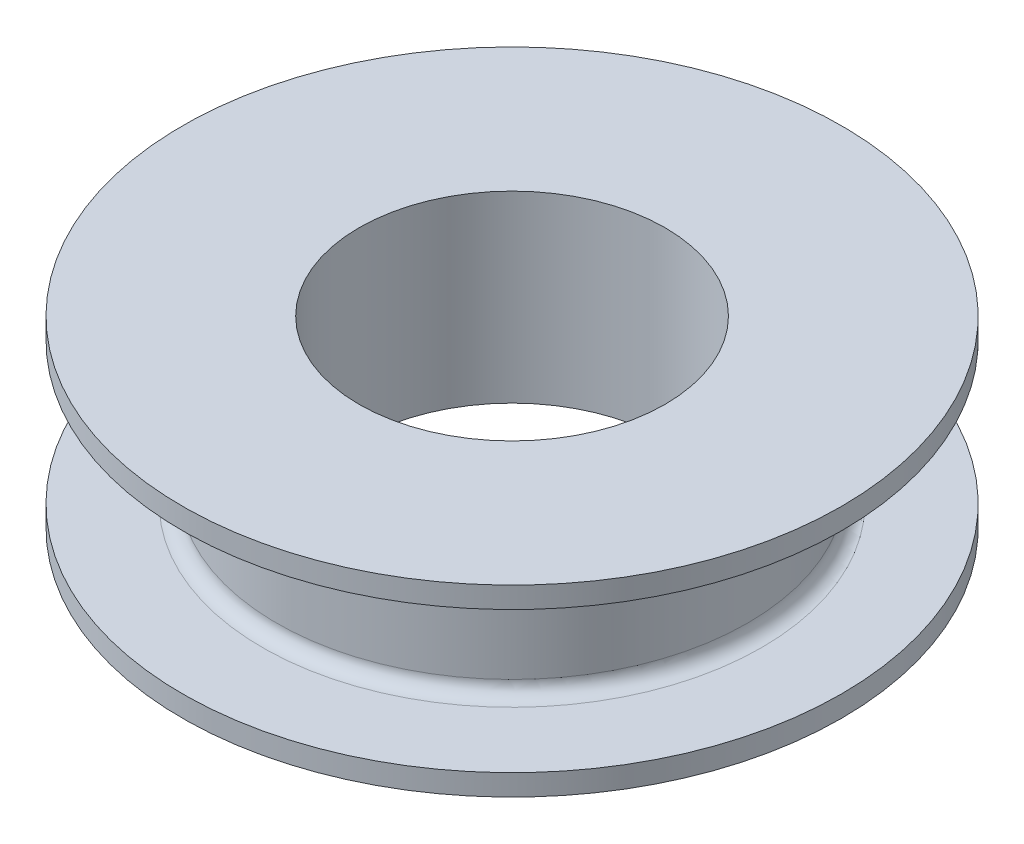
ISO-10303-21;
HEADER;
FILE_DESCRIPTION(('STEP AP214'),'2;1');
FILE_NAME('part.step','',(''),(''),'','','');
FILE_SCHEMA(('AUTOMOTIVE_DESIGN { 1 0 10303 214 1 1 1 1 }'));
ENDSEC;
DATA;
#1=APPLICATION_CONTEXT('core data for automotive mechanical design processes');
#2=APPLICATION_PROTOCOL_DEFINITION('international standard','automotive_design',2000,#1);
#3=PRODUCT_CONTEXT('',#1,'mechanical');
#4=PRODUCT('Part','Part','',(#3));
#5=PRODUCT_RELATED_PRODUCT_CATEGORY('part','',(#4));
#6=PRODUCT_DEFINITION_FORMATION('','',#4);
#7=PRODUCT_DEFINITION_CONTEXT('part definition',#1,'design');
#8=PRODUCT_DEFINITION('design','',#6,#7);
#9=PRODUCT_DEFINITION_SHAPE('','',#8);
#10=(LENGTH_UNIT() NAMED_UNIT(*) SI_UNIT(.MILLI.,.METRE.));
#11=(NAMED_UNIT(*) PLANE_ANGLE_UNIT() SI_UNIT($,.RADIAN.));
#12=(NAMED_UNIT(*) SI_UNIT($,.STERADIAN.) SOLID_ANGLE_UNIT());
#13=UNCERTAINTY_MEASURE_WITH_UNIT(LENGTH_MEASURE(1.E-05),#10,'distance_accuracy_value','');
#14=(GEOMETRIC_REPRESENTATION_CONTEXT(3) GLOBAL_UNCERTAINTY_ASSIGNED_CONTEXT((#13)) GLOBAL_UNIT_ASSIGNED_CONTEXT((#10,
#11,#12)) REPRESENTATION_CONTEXT('',''));
#15=CARTESIAN_POINT('',(0.,0.,0.));
#16=DIRECTION('',(0.,0.,1.));
#17=DIRECTION('',(1.,0.,0.));
#18=AXIS2_PLACEMENT_3D('',#15,#16,#17);
#19=CARTESIAN_POINT('',(0.,1.95,0.));
#20=DIRECTION('',(0.,-1.,0.));
#21=DIRECTION('',(1.,0.,0.));
#22=AXIS2_PLACEMENT_3D('',#19,#20,#21);
#23=CYLINDRICAL_SURFACE('',#22,7.);
#24=CARTESIAN_POINT('',(0.,3.9,0.));
#25=DIRECTION('',(0.,-1.,0.));
#26=DIRECTION('',(1.,0.,0.));
#27=AXIS2_PLACEMENT_3D('',#24,#25,#26);
#28=CIRCLE('',#27,7.);
#29=CARTESIAN_POINT('',(7.,3.9,0.));
#30=VERTEX_POINT('',#29);
#31=EDGE_CURVE('E67',#30,#30,#28,.T.);
#32=ORIENTED_EDGE('',*,*,#31,.T.);
#33=EDGE_LOOP('',(#32));
#34=FACE_BOUND('',#33,.T.);
#35=CARTESIAN_POINT('',(0.,3.45,0.));
#36=DIRECTION('',(0.,-1.,0.));
#37=DIRECTION('',(1.,0.,0.));
#38=AXIS2_PLACEMENT_3D('',#35,#36,#37);
#39=CIRCLE('',#38,7.);
#40=CARTESIAN_POINT('',(7.,3.45,0.));
#41=VERTEX_POINT('',#40);
#42=EDGE_CURVE('E10',#41,#41,#39,.T.);
#43=ORIENTED_EDGE('',*,*,#42,.F.);
#44=EDGE_LOOP('',(#43));
#45=FACE_BOUND('',#44,.T.);
#46=ADVANCED_FACE('F33',(#34,#45),#23,.T.);
#47=CARTESIAN_POINT('',(7.,3.45,0.));
#48=DIRECTION('',(0.,-1.,0.));
#49=DIRECTION('',(1.,0.,0.));
#50=AXIS2_PLACEMENT_3D('',#47,#48,#49);
#51=PLANE('',#50);
#52=ORIENTED_EDGE('',*,*,#42,.T.);
#53=EDGE_LOOP('',(#52));
#54=FACE_BOUND('',#53,.T.);
#55=CARTESIAN_POINT('',(0.,3.45,0.));
#56=DIRECTION('',(0.,-1.,0.));
#57=DIRECTION('',(1.,0.,0.));
#58=AXIS2_PLACEMENT_3D('',#55,#56,#57);
#59=CIRCLE('',#58,5.3);
#60=CARTESIAN_POINT('',(5.3,3.45,0.));
#61=VERTEX_POINT('',#60);
#62=EDGE_CURVE('E39',#61,#61,#59,.T.);
#63=ORIENTED_EDGE('',*,*,#62,.F.);
#64=EDGE_LOOP('',(#63));
#65=FACE_BOUND('',#64,.T.);
#66=ADVANCED_FACE('F85',(#54,#65),#51,.T.);
#67=CARTESIAN_POINT('',(0.,3.15,0.));
#68=DIRECTION('',(0.,-1.,0.));
#69=DIRECTION('',(1.,0.,0.));
#70=AXIS2_PLACEMENT_3D('',#67,#68,#69);
#71=TOROIDAL_SURFACE('',#70,5.3,0.3);
#72=ORIENTED_EDGE('',*,*,#62,.T.);
#73=EDGE_LOOP('',(#72));
#74=FACE_BOUND('',#73,.T.);
#75=CARTESIAN_POINT('',(0.,3.15,0.));
#76=DIRECTION('',(0.,-1.,0.));
#77=DIRECTION('',(1.,0.,0.));
#78=AXIS2_PLACEMENT_3D('',#75,#76,#77);
#79=CIRCLE('',#78,5.);
#80=CARTESIAN_POINT('',(5.,3.15,0.));
#81=VERTEX_POINT('',#80);
#82=EDGE_CURVE('E43',#81,#81,#79,.T.);
#83=ORIENTED_EDGE('',*,*,#82,.F.);
#84=EDGE_LOOP('',(#83));
#85=FACE_BOUND('',#84,.T.);
#86=ADVANCED_FACE('F89',(#74,#85),#71,.F.);
#87=CARTESIAN_POINT('',(0.,1.95,0.));
#88=DIRECTION('',(0.,-1.,0.));
#89=DIRECTION('',(1.,0.,0.));
#90=AXIS2_PLACEMENT_3D('',#87,#88,#89);
#91=CYLINDRICAL_SURFACE('',#90,5.);
#92=ORIENTED_EDGE('',*,*,#82,.T.);
#93=EDGE_LOOP('',(#92));
#94=FACE_BOUND('',#93,.T.);
#95=CARTESIAN_POINT('',(0.,0.749999999999999,0.));
#96=DIRECTION('',(0.,-1.,0.));
#97=DIRECTION('',(1.,0.,0.));
#98=AXIS2_PLACEMENT_3D('',#95,#96,#97);
#99=CIRCLE('',#98,5.);
#100=CARTESIAN_POINT('',(5.,0.75,0.));
#101=VERTEX_POINT('',#100);
#102=EDGE_CURVE('E47',#101,#101,#99,.T.);
#103=ORIENTED_EDGE('',*,*,#102,.F.);
#104=EDGE_LOOP('',(#103));
#105=FACE_BOUND('',#104,.T.);
#106=ADVANCED_FACE('F93',(#94,#105),#91,.T.);
#107=CARTESIAN_POINT('',(0.,0.749999999999999,0.));
#108=DIRECTION('',(0.,-1.,0.));
#109=DIRECTION('',(1.,0.,0.));
#110=AXIS2_PLACEMENT_3D('',#107,#108,#109);
#111=TOROIDAL_SURFACE('',#110,5.3,0.3);
#112=ORIENTED_EDGE('',*,*,#102,.T.);
#113=EDGE_LOOP('',(#112));
#114=FACE_BOUND('',#113,.T.);
#115=CARTESIAN_POINT('',(0.,0.449999999999999,0.));
#116=DIRECTION('',(0.,-1.,0.));
#117=DIRECTION('',(1.,0.,0.));
#118=AXIS2_PLACEMENT_3D('',#115,#116,#117);
#119=CIRCLE('',#118,5.3);
#120=CARTESIAN_POINT('',(5.3,0.45,0.));
#121=VERTEX_POINT('',#120);
#122=EDGE_CURVE('E52',#121,#121,#119,.T.);
#123=ORIENTED_EDGE('',*,*,#122,.F.);
#124=EDGE_LOOP('',(#123));
#125=FACE_BOUND('',#124,.T.);
#126=ADVANCED_FACE('F99',(#114,#125),#111,.F.);
#127=CARTESIAN_POINT('',(7.,0.450000000000001,0.));
#128=DIRECTION('',(0.,1.,0.));
#129=DIRECTION('',(-1.,0.,0.));
#130=AXIS2_PLACEMENT_3D('',#127,#128,#129);
#131=PLANE('',#130);
#132=ORIENTED_EDGE('',*,*,#122,.T.);
#133=EDGE_LOOP('',(#132));
#134=FACE_BOUND('',#133,.T.);
#135=CARTESIAN_POINT('',(0.,0.449999999999999,0.));
#136=DIRECTION('',(0.,-1.,0.));
#137=DIRECTION('',(1.,0.,0.));
#138=AXIS2_PLACEMENT_3D('',#135,#136,#137);
#139=CIRCLE('',#138,7.);
#140=CARTESIAN_POINT('',(7.,0.450000000000001,0.));
#141=VERTEX_POINT('',#140);
#142=EDGE_CURVE('E55',#141,#141,#139,.T.);
#143=ORIENTED_EDGE('',*,*,#142,.F.);
#144=EDGE_LOOP('',(#143));
#145=FACE_BOUND('',#144,.T.);
#146=ADVANCED_FACE('F103',(#134,#145),#131,.T.);
#147=CARTESIAN_POINT('',(0.,1.95,0.));
#148=DIRECTION('',(0.,-1.,0.));
#149=DIRECTION('',(1.,0.,0.));
#150=AXIS2_PLACEMENT_3D('',#147,#148,#149);
#151=CYLINDRICAL_SURFACE('',#150,7.);
#152=ORIENTED_EDGE('',*,*,#142,.T.);
#153=EDGE_LOOP('',(#152));
#154=FACE_BOUND('',#153,.T.);
#155=CARTESIAN_POINT('',(0.,0.,0.));
#156=DIRECTION('',(0.,-1.,0.));
#157=DIRECTION('',(1.,0.,0.));
#158=AXIS2_PLACEMENT_3D('',#155,#156,#157);
#159=CIRCLE('',#158,7.);
#160=CARTESIAN_POINT('',(7.,0.,0.));
#161=VERTEX_POINT('',#160);
#162=EDGE_CURVE('E58',#161,#161,#159,.T.);
#163=ORIENTED_EDGE('',*,*,#162,.F.);
#164=EDGE_LOOP('',(#163));
#165=FACE_BOUND('',#164,.T.);
#166=ADVANCED_FACE('F107',(#154,#165),#151,.T.);
#167=CARTESIAN_POINT('',(3.25,0.,0.));
#168=DIRECTION('',(0.,-1.,0.));
#169=DIRECTION('',(1.,0.,0.));
#170=AXIS2_PLACEMENT_3D('',#167,#168,#169);
#171=PLANE('',#170);
#172=ORIENTED_EDGE('',*,*,#162,.T.);
#173=EDGE_LOOP('',(#172));
#174=FACE_BOUND('',#173,.T.);
#175=CARTESIAN_POINT('',(0.,0.,0.));
#176=DIRECTION('',(0.,-1.,0.));
#177=DIRECTION('',(1.,0.,0.));
#178=AXIS2_PLACEMENT_3D('',#175,#176,#177);
#179=CIRCLE('',#178,3.25);
#180=CARTESIAN_POINT('',(3.25,0.,0.));
#181=VERTEX_POINT('',#180);
#182=EDGE_CURVE('E61',#181,#181,#179,.T.);
#183=ORIENTED_EDGE('',*,*,#182,.F.);
#184=EDGE_LOOP('',(#183));
#185=FACE_BOUND('',#184,.T.);
#186=ADVANCED_FACE('F81',(#174,#185),#171,.T.);
#187=CARTESIAN_POINT('',(0.,1.95,0.));
#188=DIRECTION('',(0.,-1.,0.));
#189=DIRECTION('',(1.,0.,0.));
#190=AXIS2_PLACEMENT_3D('',#187,#188,#189);
#191=CYLINDRICAL_SURFACE('',#190,3.25);
#192=ORIENTED_EDGE('',*,*,#182,.T.);
#193=EDGE_LOOP('',(#192));
#194=FACE_BOUND('',#193,.T.);
#195=CARTESIAN_POINT('',(0.,3.9,0.));
#196=DIRECTION('',(0.,-1.,0.));
#197=DIRECTION('',(1.,0.,0.));
#198=AXIS2_PLACEMENT_3D('',#195,#196,#197);
#199=CIRCLE('',#198,3.25);
#200=CARTESIAN_POINT('',(3.25,3.9,0.));
#201=VERTEX_POINT('',#200);
#202=EDGE_CURVE('E64',#201,#201,#199,.T.);
#203=ORIENTED_EDGE('',*,*,#202,.F.);
#204=EDGE_LOOP('',(#203));
#205=FACE_BOUND('',#204,.T.);
#206=ADVANCED_FACE('F75',(#194,#205),#191,.F.);
#207=CARTESIAN_POINT('',(3.25,3.9,0.));
#208=DIRECTION('',(0.,1.,0.));
#209=DIRECTION('',(-1.,0.,0.));
#210=AXIS2_PLACEMENT_3D('',#207,#208,#209);
#211=PLANE('',#210);
#212=ORIENTED_EDGE('',*,*,#202,.T.);
#213=EDGE_LOOP('',(#212));
#214=FACE_BOUND('',#213,.T.);
#215=ORIENTED_EDGE('',*,*,#31,.F.);
#216=EDGE_LOOP('',(#215));
#217=FACE_BOUND('',#216,.T.);
#218=ADVANCED_FACE('F73',(#214,#217),#211,.T.);
#219=CLOSED_SHELL('',(#46,#66,#86,#106,#126,#146,#166,#186,#206,#218));
#220=MANIFOLD_SOLID_BREP('B2',#219);
#221=ADVANCED_BREP_SHAPE_REPRESENTATION('',(#18,#220),#14);
#222=SHAPE_DEFINITION_REPRESENTATION(#9,#221);
ENDSEC;
END-ISO-10303-21;
